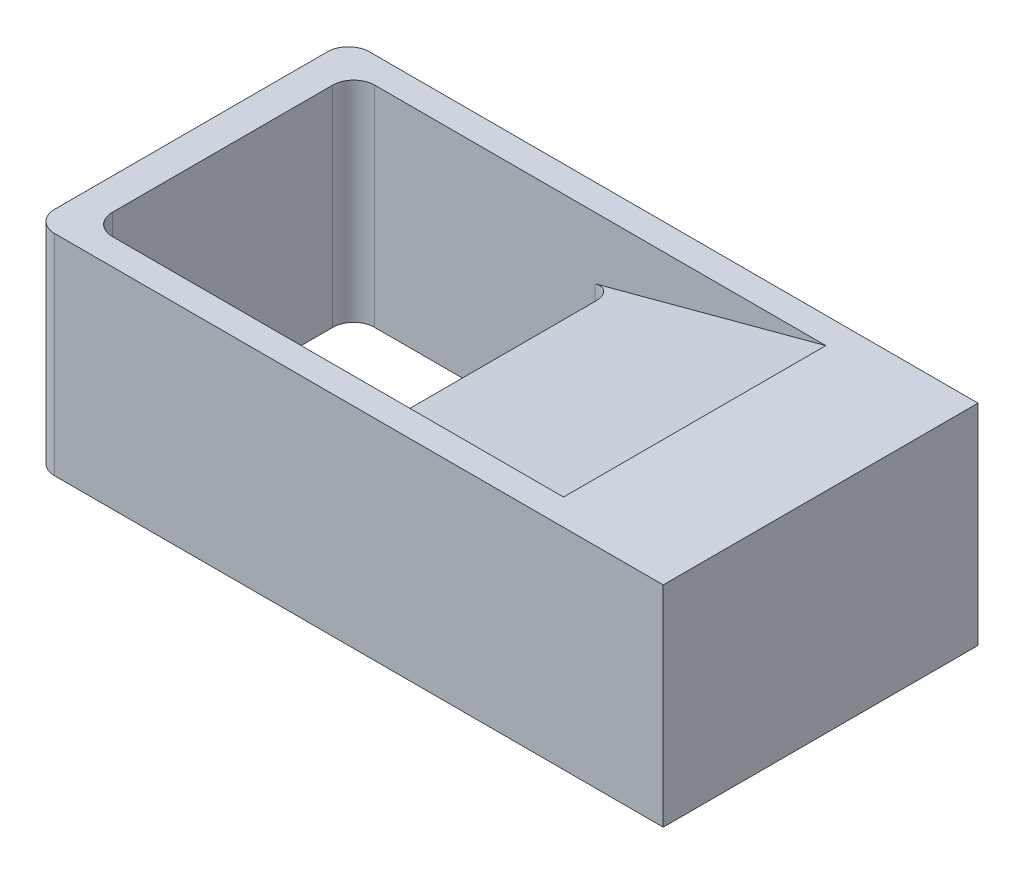
ISO-10303-21;
HEADER;
FILE_DESCRIPTION(('STEP AP214'),'2;1');
FILE_NAME('part.step','',(''),(''),'','','');
FILE_SCHEMA(('AUTOMOTIVE_DESIGN { 1 0 10303 214 1 1 1 1 }'));
ENDSEC;
DATA;
#1=APPLICATION_CONTEXT('core data for automotive mechanical design processes');
#2=APPLICATION_PROTOCOL_DEFINITION('international standard','automotive_design',2000,#1);
#3=PRODUCT_CONTEXT('',#1,'mechanical');
#4=PRODUCT('Part','Part','',(#3));
#5=PRODUCT_RELATED_PRODUCT_CATEGORY('part','',(#4));
#6=PRODUCT_DEFINITION_FORMATION('','',#4);
#7=PRODUCT_DEFINITION_CONTEXT('part definition',#1,'design');
#8=PRODUCT_DEFINITION('design','',#6,#7);
#9=PRODUCT_DEFINITION_SHAPE('','',#8);
#10=(LENGTH_UNIT() NAMED_UNIT(*) SI_UNIT(.MILLI.,.METRE.));
#11=(NAMED_UNIT(*) PLANE_ANGLE_UNIT() SI_UNIT($,.RADIAN.));
#12=(NAMED_UNIT(*) SI_UNIT($,.STERADIAN.) SOLID_ANGLE_UNIT());
#13=UNCERTAINTY_MEASURE_WITH_UNIT(LENGTH_MEASURE(1.E-05),#10,'distance_accuracy_value','');
#14=(GEOMETRIC_REPRESENTATION_CONTEXT(3) GLOBAL_UNCERTAINTY_ASSIGNED_CONTEXT((#13)) GLOBAL_UNIT_ASSIGNED_CONTEXT((#10,
#11,#12)) REPRESENTATION_CONTEXT('',''));
#15=CARTESIAN_POINT('',(0.,0.,0.));
#16=DIRECTION('',(0.,0.,1.));
#17=DIRECTION('',(1.,0.,0.));
#18=AXIS2_PLACEMENT_3D('',#15,#16,#17);
#19=CARTESIAN_POINT('',(0.,10.,0.));
#20=DIRECTION('',(0.,-1.,0.));
#21=DIRECTION('',(0.,0.,-1.));
#22=AXIS2_PLACEMENT_3D('',#19,#20,#21);
#23=PLANE('',#22);
#24=DIRECTION('',(-1.,0.,0.));
#25=VECTOR('',#24,1.);
#26=CARTESIAN_POINT('',(0.,10.,-15.));
#27=LINE('',#26,#25);
#28=CARTESIAN_POINT('',(30.,10.,-15.));
#29=VERTEX_POINT('',#28);
#30=CARTESIAN_POINT('',(1.,10.,-15.));
#31=VERTEX_POINT('',#30);
#32=EDGE_CURVE('E173',#29,#31,#27,.T.);
#33=ORIENTED_EDGE('',*,*,#32,.T.);
#34=CARTESIAN_POINT('',(1.,10.,-14.));
#35=DIRECTION('',(0.,-1.,0.));
#36=DIRECTION('',(0.,0.,-1.));
#37=AXIS2_PLACEMENT_3D('',#34,#35,#36);
#38=CIRCLE('',#37,1.);
#39=CARTESIAN_POINT('',(0.,10.,-14.));
#40=VERTEX_POINT('',#39);
#41=EDGE_CURVE('E208',#31,#40,#38,.F.);
#42=ORIENTED_EDGE('',*,*,#41,.T.);
#43=DIRECTION('',(0.,0.,1.));
#44=VECTOR('',#43,1.);
#45=CARTESIAN_POINT('',(0.,10.,0.));
#46=LINE('',#45,#44);
#47=CARTESIAN_POINT('',(0.,10.,-1.));
#48=VERTEX_POINT('',#47);
#49=EDGE_CURVE('E158',#40,#48,#46,.T.);
#50=ORIENTED_EDGE('',*,*,#49,.T.);
#51=CARTESIAN_POINT('',(1.,10.,-1.));
#52=DIRECTION('',(0.,-1.,0.));
#53=DIRECTION('',(0.,0.,-1.));
#54=AXIS2_PLACEMENT_3D('',#51,#52,#53);
#55=CIRCLE('',#54,1.);
#56=CARTESIAN_POINT('',(1.,10.,0.));
#57=VERTEX_POINT('',#56);
#58=EDGE_CURVE('E154',#48,#57,#55,.F.);
#59=ORIENTED_EDGE('',*,*,#58,.T.);
#60=DIRECTION('',(1.,0.,0.));
#61=VECTOR('',#60,1.);
#62=CARTESIAN_POINT('',(0.,10.,0.));
#63=LINE('',#62,#61);
#64=CARTESIAN_POINT('',(30.,10.,0.));
#65=VERTEX_POINT('',#64);
#66=EDGE_CURVE('E145',#57,#65,#63,.T.);
#67=ORIENTED_EDGE('',*,*,#66,.T.);
#68=DIRECTION('',(0.,0.,-1.));
#69=VECTOR('',#68,1.);
#70=CARTESIAN_POINT('',(30.,10.,0.));
#71=LINE('',#70,#69);
#72=EDGE_CURVE('E150',#65,#29,#71,.T.);
#73=ORIENTED_EDGE('',*,*,#72,.T.);
#74=EDGE_LOOP('',(#33,#42,#50,#59,#67,#73));
#75=FACE_BOUND('',#74,.T.);
#76=DIRECTION('',(-1.,0.,0.));
#77=VECTOR('',#76,1.);
#78=CARTESIAN_POINT('',(1.5,10.,-13.75));
#79=LINE('',#78,#77);
#80=CARTESIAN_POINT('',(24.0000000000001,10.,-13.75));
#81=VERTEX_POINT('',#80);
#82=CARTESIAN_POINT('',(2.5,10.,-13.75));
#83=VERTEX_POINT('',#82);
#84=EDGE_CURVE('E181',#81,#83,#79,.T.);
#85=ORIENTED_EDGE('',*,*,#84,.F.);
#86=DIRECTION('',(0.,0.,1.));
#87=VECTOR('',#86,1.);
#88=CARTESIAN_POINT('',(24.0000000000001,10.,-1.25));
#89=LINE('',#88,#87);
#90=CARTESIAN_POINT('',(24.0000000000001,10.,-1.25));
#91=VERTEX_POINT('',#90);
#92=EDGE_CURVE('E190',#81,#91,#89,.T.);
#93=ORIENTED_EDGE('',*,*,#92,.T.);
#94=DIRECTION('',(1.,0.,0.));
#95=VECTOR('',#94,1.);
#96=CARTESIAN_POINT('',(1.5,10.,-1.25));
#97=LINE('',#96,#95);
#98=CARTESIAN_POINT('',(2.5,10.,-1.25));
#99=VERTEX_POINT('',#98);
#100=EDGE_CURVE('E267',#99,#91,#97,.T.);
#101=ORIENTED_EDGE('',*,*,#100,.F.);
#102=CARTESIAN_POINT('',(2.5,10.,-2.25));
#103=DIRECTION('',(0.,-1.,0.));
#104=DIRECTION('',(0.,0.,-1.));
#105=AXIS2_PLACEMENT_3D('',#102,#103,#104);
#106=CIRCLE('',#105,1.);
#107=CARTESIAN_POINT('',(1.5,10.,-2.25));
#108=VERTEX_POINT('',#107);
#109=EDGE_CURVE('E234',#99,#108,#106,.T.);
#110=ORIENTED_EDGE('',*,*,#109,.T.);
#111=DIRECTION('',(0.,0.,1.));
#112=VECTOR('',#111,1.);
#113=CARTESIAN_POINT('',(1.5,10.,-13.75));
#114=LINE('',#113,#112);
#115=CARTESIAN_POINT('',(1.5,10.,-12.75));
#116=VERTEX_POINT('',#115);
#117=EDGE_CURVE('E264',#116,#108,#114,.T.);
#118=ORIENTED_EDGE('',*,*,#117,.F.);
#119=CARTESIAN_POINT('',(2.5,10.,-12.75));
#120=DIRECTION('',(0.,-1.,0.));
#121=DIRECTION('',(0.,0.,-1.));
#122=AXIS2_PLACEMENT_3D('',#119,#120,#121);
#123=CIRCLE('',#122,1.);
#124=EDGE_CURVE('E11',#116,#83,#123,.T.);
#125=ORIENTED_EDGE('',*,*,#124,.T.);
#126=EDGE_LOOP('',(#85,#93,#101,#110,#118,#125));
#127=FACE_BOUND('',#126,.T.);
#128=ADVANCED_FACE('F39',(#75,#127),#23,.F.);
#129=CARTESIAN_POINT('',(0.,0.,0.));
#130=DIRECTION('',(0.,-1.,0.));
#131=DIRECTION('',(0.,0.,-1.));
#132=AXIS2_PLACEMENT_3D('',#129,#130,#131);
#133=PLANE('',#132);
#134=DIRECTION('',(0.,0.,1.));
#135=VECTOR('',#134,1.);
#136=CARTESIAN_POINT('',(0.,0.,0.));
#137=LINE('',#136,#135);
#138=CARTESIAN_POINT('',(0.,0.,-14.));
#139=VERTEX_POINT('',#138);
#140=CARTESIAN_POINT('',(0.,0.,-1.));
#141=VERTEX_POINT('',#140);
#142=EDGE_CURVE('E178',#139,#141,#137,.T.);
#143=ORIENTED_EDGE('',*,*,#142,.F.);
#144=CARTESIAN_POINT('',(1.,0.,-14.));
#145=DIRECTION('',(0.,-1.,0.));
#146=DIRECTION('',(0.,0.,-1.));
#147=AXIS2_PLACEMENT_3D('',#144,#145,#146);
#148=CIRCLE('',#147,1.);
#149=CARTESIAN_POINT('',(1.,0.,-15.));
#150=VERTEX_POINT('',#149);
#151=EDGE_CURVE('E203',#139,#150,#148,.T.);
#152=ORIENTED_EDGE('',*,*,#151,.T.);
#153=DIRECTION('',(-1.,0.,0.));
#154=VECTOR('',#153,1.);
#155=CARTESIAN_POINT('',(0.,0.,-15.));
#156=LINE('',#155,#154);
#157=CARTESIAN_POINT('',(30.,0.,-15.));
#158=VERTEX_POINT('',#157);
#159=EDGE_CURVE('E185',#158,#150,#156,.T.);
#160=ORIENTED_EDGE('',*,*,#159,.F.);
#161=DIRECTION('',(0.,0.,-1.));
#162=VECTOR('',#161,1.);
#163=CARTESIAN_POINT('',(30.,0.,0.));
#164=LINE('',#163,#162);
#165=CARTESIAN_POINT('',(30.,0.,0.));
#166=VERTEX_POINT('',#165);
#167=EDGE_CURVE('E183',#166,#158,#164,.T.);
#168=ORIENTED_EDGE('',*,*,#167,.F.);
#169=DIRECTION('',(1.,0.,0.));
#170=VECTOR('',#169,1.);
#171=CARTESIAN_POINT('',(0.,0.,0.));
#172=LINE('',#171,#170);
#173=CARTESIAN_POINT('',(1.,0.,0.));
#174=VERTEX_POINT('',#173);
#175=EDGE_CURVE('E164',#174,#166,#172,.T.);
#176=ORIENTED_EDGE('',*,*,#175,.F.);
#177=CARTESIAN_POINT('',(1.,0.,-1.));
#178=DIRECTION('',(0.,-1.,0.));
#179=DIRECTION('',(0.,0.,-1.));
#180=AXIS2_PLACEMENT_3D('',#177,#178,#179);
#181=CIRCLE('',#180,1.);
#182=EDGE_CURVE('E201',#174,#141,#181,.T.);
#183=ORIENTED_EDGE('',*,*,#182,.T.);
#184=EDGE_LOOP('',(#143,#152,#160,#168,#176,#183));
#185=FACE_BOUND('',#184,.T.);
#186=DIRECTION('',(0.,0.,-1.));
#187=VECTOR('',#186,1.);
#188=CARTESIAN_POINT('',(14.,0.,-13.75));
#189=LINE('',#188,#187);
#190=CARTESIAN_POINT('',(14.,0.,-2.25));
#191=VERTEX_POINT('',#190);
#192=CARTESIAN_POINT('',(14.,0.,-12.75));
#193=VERTEX_POINT('',#192);
#194=EDGE_CURVE('E274',#191,#193,#189,.T.);
#195=ORIENTED_EDGE('',*,*,#194,.T.);
#196=CARTESIAN_POINT('',(13.,0.,-12.75));
#197=DIRECTION('',(0.,-1.,0.));
#198=DIRECTION('',(0.,0.,-1.));
#199=AXIS2_PLACEMENT_3D('',#196,#197,#198);
#200=CIRCLE('',#199,1.);
#201=CARTESIAN_POINT('',(13.,0.,-13.75));
#202=VERTEX_POINT('',#201);
#203=EDGE_CURVE('E241',#193,#202,#200,.F.);
#204=ORIENTED_EDGE('',*,*,#203,.T.);
#205=DIRECTION('',(-1.,0.,0.));
#206=VECTOR('',#205,1.);
#207=CARTESIAN_POINT('',(1.5,0.,-13.75));
#208=LINE('',#207,#206);
#209=CARTESIAN_POINT('',(2.5,0.,-13.75));
#210=VERTEX_POINT('',#209);
#211=EDGE_CURVE('E251',#202,#210,#208,.T.);
#212=ORIENTED_EDGE('',*,*,#211,.T.);
#213=CARTESIAN_POINT('',(2.5,0.,-12.75));
#214=DIRECTION('',(0.,-1.,0.));
#215=DIRECTION('',(0.,0.,-1.));
#216=AXIS2_PLACEMENT_3D('',#213,#214,#215);
#217=CIRCLE('',#216,1.);
#218=CARTESIAN_POINT('',(1.5,0.,-12.75));
#219=VERTEX_POINT('',#218);
#220=EDGE_CURVE('E47',#210,#219,#217,.F.);
#221=ORIENTED_EDGE('',*,*,#220,.T.);
#222=DIRECTION('',(0.,0.,1.));
#223=VECTOR('',#222,1.);
#224=CARTESIAN_POINT('',(1.5,0.,-13.75));
#225=LINE('',#224,#223);
#226=CARTESIAN_POINT('',(1.5,0.,-2.25));
#227=VERTEX_POINT('',#226);
#228=EDGE_CURVE('E249',#219,#227,#225,.T.);
#229=ORIENTED_EDGE('',*,*,#228,.T.);
#230=CARTESIAN_POINT('',(2.5,0.,-2.25));
#231=DIRECTION('',(0.,-1.,0.));
#232=DIRECTION('',(0.,0.,-1.));
#233=AXIS2_PLACEMENT_3D('',#230,#231,#232);
#234=CIRCLE('',#233,1.);
#235=CARTESIAN_POINT('',(2.5,0.,-1.25));
#236=VERTEX_POINT('',#235);
#237=EDGE_CURVE('E232',#227,#236,#234,.F.);
#238=ORIENTED_EDGE('',*,*,#237,.T.);
#239=DIRECTION('',(1.,0.,0.));
#240=VECTOR('',#239,1.);
#241=CARTESIAN_POINT('',(1.5,0.,-1.25));
#242=LINE('',#241,#240);
#243=CARTESIAN_POINT('',(13.,0.,-1.25));
#244=VERTEX_POINT('',#243);
#245=EDGE_CURVE('E260',#236,#244,#242,.T.);
#246=ORIENTED_EDGE('',*,*,#245,.T.);
#247=CARTESIAN_POINT('',(13.,0.,-2.25));
#248=DIRECTION('',(0.,-1.,0.));
#249=DIRECTION('',(0.,0.,-1.));
#250=AXIS2_PLACEMENT_3D('',#247,#248,#249);
#251=CIRCLE('',#250,1.);
#252=EDGE_CURVE('E236',#244,#191,#251,.F.);
#253=ORIENTED_EDGE('',*,*,#252,.T.);
#254=EDGE_LOOP('',(#195,#204,#212,#221,#229,#238,#246,#253));
#255=FACE_BOUND('',#254,.T.);
#256=ADVANCED_FACE('F248',(#185,#255),#133,.T.);
#257=CARTESIAN_POINT('',(0.,10.,0.));
#258=DIRECTION('',(1.,0.,0.));
#259=DIRECTION('',(0.,0.,-1.));
#260=AXIS2_PLACEMENT_3D('',#257,#258,#259);
#261=PLANE('',#260);
#262=ORIENTED_EDGE('',*,*,#49,.F.);
#263=DIRECTION('',(0.,-1.,0.));
#264=VECTOR('',#263,1.);
#265=CARTESIAN_POINT('',(0.,10.,-14.));
#266=LINE('',#265,#264);
#267=EDGE_CURVE('E198',#40,#139,#266,.T.);
#268=ORIENTED_EDGE('',*,*,#267,.T.);
#269=ORIENTED_EDGE('',*,*,#142,.T.);
#270=DIRECTION('',(0.,-1.,0.));
#271=VECTOR('',#270,1.);
#272=CARTESIAN_POINT('',(0.,10.,-1.));
#273=LINE('',#272,#271);
#274=EDGE_CURVE('E196',#141,#48,#273,.F.);
#275=ORIENTED_EDGE('',*,*,#274,.T.);
#276=EDGE_LOOP('',(#262,#268,#269,#275));
#277=FACE_BOUND('',#276,.T.);
#278=ADVANCED_FACE('F291',(#277),#261,.F.);
#279=CARTESIAN_POINT('',(0.,10.,0.));
#280=DIRECTION('',(0.,0.,-1.));
#281=DIRECTION('',(-1.,0.,0.));
#282=AXIS2_PLACEMENT_3D('',#279,#280,#281);
#283=PLANE('',#282);
#284=ORIENTED_EDGE('',*,*,#66,.F.);
#285=DIRECTION('',(0.,-1.,0.));
#286=VECTOR('',#285,1.);
#287=CARTESIAN_POINT('',(1.,10.,0.));
#288=LINE('',#287,#286);
#289=EDGE_CURVE('E210',#57,#174,#288,.T.);
#290=ORIENTED_EDGE('',*,*,#289,.T.);
#291=ORIENTED_EDGE('',*,*,#175,.T.);
#292=DIRECTION('',(0.,-1.,0.));
#293=VECTOR('',#292,1.);
#294=CARTESIAN_POINT('',(30.,10.,0.));
#295=LINE('',#294,#293);
#296=EDGE_CURVE('E161',#65,#166,#295,.T.);
#297=ORIENTED_EDGE('',*,*,#296,.F.);
#298=EDGE_LOOP('',(#284,#290,#291,#297));
#299=FACE_BOUND('',#298,.T.);
#300=ADVANCED_FACE('F162',(#299),#283,.F.);
#301=CARTESIAN_POINT('',(30.,10.,0.));
#302=DIRECTION('',(-1.,0.,0.));
#303=DIRECTION('',(0.,0.,1.));
#304=AXIS2_PLACEMENT_3D('',#301,#302,#303);
#305=PLANE('',#304);
#306=ORIENTED_EDGE('',*,*,#167,.T.);
#307=DIRECTION('',(0.,-1.,0.));
#308=VECTOR('',#307,1.);
#309=CARTESIAN_POINT('',(30.,10.,-15.));
#310=LINE('',#309,#308);
#311=EDGE_CURVE('E168',#29,#158,#310,.T.);
#312=ORIENTED_EDGE('',*,*,#311,.F.);
#313=ORIENTED_EDGE('',*,*,#72,.F.);
#314=ORIENTED_EDGE('',*,*,#296,.T.);
#315=EDGE_LOOP('',(#306,#312,#313,#314));
#316=FACE_BOUND('',#315,.T.);
#317=ADVANCED_FACE('F170',(#316),#305,.F.);
#318=CARTESIAN_POINT('',(0.,10.,-15.));
#319=DIRECTION('',(0.,0.,1.));
#320=DIRECTION('',(1.,0.,0.));
#321=AXIS2_PLACEMENT_3D('',#318,#319,#320);
#322=PLANE('',#321);
#323=ORIENTED_EDGE('',*,*,#159,.T.);
#324=DIRECTION('',(0.,-1.,0.));
#325=VECTOR('',#324,1.);
#326=CARTESIAN_POINT('',(1.,10.,-15.));
#327=LINE('',#326,#325);
#328=EDGE_CURVE('E205',#150,#31,#327,.F.);
#329=ORIENTED_EDGE('',*,*,#328,.T.);
#330=ORIENTED_EDGE('',*,*,#32,.F.);
#331=ORIENTED_EDGE('',*,*,#311,.T.);
#332=EDGE_LOOP('',(#323,#329,#330,#331));
#333=FACE_BOUND('',#332,.T.);
#334=ADVANCED_FACE('F287',(#333),#322,.F.);
#335=CARTESIAN_POINT('',(1.5,10.,-13.75));
#336=DIRECTION('',(1.,0.,0.));
#337=DIRECTION('',(0.,0.,-1.));
#338=AXIS2_PLACEMENT_3D('',#335,#336,#337);
#339=PLANE('',#338);
#340=ORIENTED_EDGE('',*,*,#117,.T.);
#341=DIRECTION('',(0.,-1.,0.));
#342=VECTOR('',#341,1.);
#343=CARTESIAN_POINT('',(1.5,0.,-2.25));
#344=LINE('',#343,#342);
#345=EDGE_CURVE('E214',#108,#227,#344,.T.);
#346=ORIENTED_EDGE('',*,*,#345,.T.);
#347=ORIENTED_EDGE('',*,*,#228,.F.);
#348=DIRECTION('',(0.,-1.,0.));
#349=VECTOR('',#348,1.);
#350=CARTESIAN_POINT('',(1.5,10.,-12.75));
#351=LINE('',#350,#349);
#352=EDGE_CURVE('E212',#219,#116,#351,.F.);
#353=ORIENTED_EDGE('',*,*,#352,.T.);
#354=EDGE_LOOP('',(#340,#346,#347,#353));
#355=FACE_BOUND('',#354,.T.);
#356=ADVANCED_FACE('F257',(#355),#339,.T.);
#357=CARTESIAN_POINT('',(1.5,10.,-1.25));
#358=DIRECTION('',(0.,0.,-1.));
#359=DIRECTION('',(-1.,0.,0.));
#360=AXIS2_PLACEMENT_3D('',#357,#358,#359);
#361=PLANE('',#360);
#362=ORIENTED_EDGE('',*,*,#245,.F.);
#363=DIRECTION('',(0.,-1.,0.));
#364=VECTOR('',#363,1.);
#365=CARTESIAN_POINT('',(2.5,10.,-1.25));
#366=LINE('',#365,#364);
#367=EDGE_CURVE('E220',#236,#99,#366,.F.);
#368=ORIENTED_EDGE('',*,*,#367,.T.);
#369=ORIENTED_EDGE('',*,*,#100,.T.);
#370=DIRECTION('',(-0.965925826289069,-0.258819045102518,0.));
#371=VECTOR('',#370,1.);
#372=CARTESIAN_POINT('',(14.,7.32050807568877,-1.25));
#373=LINE('',#372,#371);
#374=CARTESIAN_POINT('',(13.,7.05255888325765,-1.25));
#375=VERTEX_POINT('',#374);
#376=EDGE_CURVE('E194',#91,#375,#373,.T.);
#377=ORIENTED_EDGE('',*,*,#376,.T.);
#378=DIRECTION('',(0.,-1.,0.));
#379=VECTOR('',#378,1.);
#380=CARTESIAN_POINT('',(13.,0.,-1.25));
#381=LINE('',#380,#379);
#382=EDGE_CURVE('E217',#375,#244,#381,.T.);
#383=ORIENTED_EDGE('',*,*,#382,.T.);
#384=EDGE_LOOP('',(#362,#368,#369,#377,#383));
#385=FACE_BOUND('',#384,.T.);
#386=ADVANCED_FACE('F325',(#385),#361,.T.);
#387=CARTESIAN_POINT('',(14.,10.,-13.75));
#388=DIRECTION('',(-1.,0.,0.));
#389=DIRECTION('',(0.,0.,1.));
#390=AXIS2_PLACEMENT_3D('',#387,#388,#389);
#391=PLANE('',#390);
#392=ORIENTED_EDGE('',*,*,#194,.F.);
#393=DIRECTION('',(0.,-1.,0.));
#394=VECTOR('',#393,1.);
#395=CARTESIAN_POINT('',(14.,7.32050807568877,-2.25));
#396=LINE('',#395,#394);
#397=CARTESIAN_POINT('',(14.,7.32050807568877,-2.25));
#398=VERTEX_POINT('',#397);
#399=EDGE_CURVE('E225',#191,#398,#396,.F.);
#400=ORIENTED_EDGE('',*,*,#399,.T.);
#401=DIRECTION('',(0.,0.,-1.));
#402=VECTOR('',#401,1.);
#403=CARTESIAN_POINT('',(14.,7.32050807568877,-13.75));
#404=LINE('',#403,#402);
#405=CARTESIAN_POINT('',(14.,7.32050807568877,-12.75));
#406=VERTEX_POINT('',#405);
#407=EDGE_CURVE('E167',#398,#406,#404,.T.);
#408=ORIENTED_EDGE('',*,*,#407,.T.);
#409=DIRECTION('',(0.,-1.,0.));
#410=VECTOR('',#409,1.);
#411=CARTESIAN_POINT('',(14.,0.,-12.75));
#412=LINE('',#411,#410);
#413=EDGE_CURVE('E222',#406,#193,#412,.T.);
#414=ORIENTED_EDGE('',*,*,#413,.T.);
#415=EDGE_LOOP('',(#392,#400,#408,#414));
#416=FACE_BOUND('',#415,.T.);
#417=ADVANCED_FACE('F331',(#416),#391,.T.);
#418=CARTESIAN_POINT('',(1.5,10.,-13.75));
#419=DIRECTION('',(0.,0.,1.));
#420=DIRECTION('',(1.,0.,0.));
#421=AXIS2_PLACEMENT_3D('',#418,#419,#420);
#422=PLANE('',#421);
#423=ORIENTED_EDGE('',*,*,#211,.F.);
#424=DIRECTION('',(0.,-1.,0.));
#425=VECTOR('',#424,1.);
#426=CARTESIAN_POINT('',(13.,7.32050807568877,-13.75));
#427=LINE('',#426,#425);
#428=CARTESIAN_POINT('',(13.,7.05255888325765,-13.75));
#429=VERTEX_POINT('',#428);
#430=EDGE_CURVE('E230',#202,#429,#427,.F.);
#431=ORIENTED_EDGE('',*,*,#430,.T.);
#432=DIRECTION('',(0.965925826289069,0.258819045102518,0.));
#433=VECTOR('',#432,1.);
#434=CARTESIAN_POINT('',(14.,7.32050807568877,-13.75));
#435=LINE('',#434,#433);
#436=EDGE_CURVE('E54',#429,#81,#435,.T.);
#437=ORIENTED_EDGE('',*,*,#436,.T.);
#438=ORIENTED_EDGE('',*,*,#84,.T.);
#439=DIRECTION('',(0.,-1.,0.));
#440=VECTOR('',#439,1.);
#441=CARTESIAN_POINT('',(2.5,0.,-13.75));
#442=LINE('',#441,#440);
#443=EDGE_CURVE('E227',#83,#210,#442,.T.);
#444=ORIENTED_EDGE('',*,*,#443,.T.);
#445=EDGE_LOOP('',(#423,#431,#437,#438,#444));
#446=FACE_BOUND('',#445,.T.);
#447=ADVANCED_FACE('F266',(#446),#422,.T.);
#448=CARTESIAN_POINT('',(14.,7.32050807568877,-13.75));
#449=DIRECTION('',(-0.258819045102518,0.965925826289069,0.));
#450=DIRECTION('',(0.,0.,1.));
#451=AXIS2_PLACEMENT_3D('',#448,#449,#450);
#452=PLANE('',#451);
#453=ORIENTED_EDGE('',*,*,#376,.F.);
#454=ORIENTED_EDGE('',*,*,#92,.F.);
#455=ORIENTED_EDGE('',*,*,#436,.F.);
#456=CARTESIAN_POINT('',(13.,7.05255888325765,-12.75));
#457=DIRECTION('',(-0.258819045102518,0.965925826289069,0.));
#458=DIRECTION('',(0.965925826289069,0.258819045102518,0.));
#459=AXIS2_PLACEMENT_3D('',#456,#457,#458);
#460=ELLIPSE('',#459,1.03527618041008,1.);
#461=EDGE_CURVE('E59',#429,#406,#460,.F.);
#462=ORIENTED_EDGE('',*,*,#461,.T.);
#463=ORIENTED_EDGE('',*,*,#407,.F.);
#464=CARTESIAN_POINT('',(13.,7.05255888325765,-2.25));
#465=DIRECTION('',(-0.258819045102518,0.965925826289069,0.));
#466=DIRECTION('',(0.965925826289069,0.258819045102518,0.));
#467=AXIS2_PLACEMENT_3D('',#464,#465,#466);
#468=ELLIPSE('',#467,1.03527618041008,1.);
#469=EDGE_CURVE('E238',#398,#375,#468,.F.);
#470=ORIENTED_EDGE('',*,*,#469,.T.);
#471=EDGE_LOOP('',(#453,#454,#455,#462,#463,#470));
#472=FACE_BOUND('',#471,.T.);
#473=ADVANCED_FACE('F345',(#472),#452,.T.);
#474=CARTESIAN_POINT('',(1.,10.,-14.));
#475=DIRECTION('',(0.,-1.,0.));
#476=DIRECTION('',(0.,0.,-1.));
#477=AXIS2_PLACEMENT_3D('',#474,#475,#476);
#478=CYLINDRICAL_SURFACE('',#477,1.);
#479=ORIENTED_EDGE('',*,*,#41,.F.);
#480=ORIENTED_EDGE('',*,*,#328,.F.);
#481=ORIENTED_EDGE('',*,*,#151,.F.);
#482=ORIENTED_EDGE('',*,*,#267,.F.);
#483=EDGE_LOOP('',(#479,#480,#481,#482));
#484=FACE_BOUND('',#483,.T.);
#485=ADVANCED_FACE('F290',(#484),#478,.T.);
#486=CARTESIAN_POINT('',(1.,10.,-1.));
#487=DIRECTION('',(0.,-1.,0.));
#488=DIRECTION('',(0.,0.,-1.));
#489=AXIS2_PLACEMENT_3D('',#486,#487,#488);
#490=CYLINDRICAL_SURFACE('',#489,1.);
#491=ORIENTED_EDGE('',*,*,#58,.F.);
#492=ORIENTED_EDGE('',*,*,#274,.F.);
#493=ORIENTED_EDGE('',*,*,#182,.F.);
#494=ORIENTED_EDGE('',*,*,#289,.F.);
#495=EDGE_LOOP('',(#491,#492,#493,#494));
#496=FACE_BOUND('',#495,.T.);
#497=ADVANCED_FACE('F282',(#496),#490,.T.);
#498=CARTESIAN_POINT('',(2.5,10.,-2.25));
#499=DIRECTION('',(0.,1.,0.));
#500=DIRECTION('',(0.,0.,1.));
#501=AXIS2_PLACEMENT_3D('',#498,#499,#500);
#502=CYLINDRICAL_SURFACE('',#501,1.);
#503=ORIENTED_EDGE('',*,*,#109,.F.);
#504=ORIENTED_EDGE('',*,*,#367,.F.);
#505=ORIENTED_EDGE('',*,*,#237,.F.);
#506=ORIENTED_EDGE('',*,*,#345,.F.);
#507=EDGE_LOOP('',(#503,#504,#505,#506));
#508=FACE_BOUND('',#507,.T.);
#509=ADVANCED_FACE('F363',(#508),#502,.F.);
#510=CARTESIAN_POINT('',(13.,10.,-2.25));
#511=DIRECTION('',(0.,1.,0.));
#512=DIRECTION('',(0.,0.,1.));
#513=AXIS2_PLACEMENT_3D('',#510,#511,#512);
#514=CYLINDRICAL_SURFACE('',#513,1.);
#515=ORIENTED_EDGE('',*,*,#469,.F.);
#516=ORIENTED_EDGE('',*,*,#399,.F.);
#517=ORIENTED_EDGE('',*,*,#252,.F.);
#518=ORIENTED_EDGE('',*,*,#382,.F.);
#519=EDGE_LOOP('',(#515,#516,#517,#518));
#520=FACE_BOUND('',#519,.T.);
#521=ADVANCED_FACE('F370',(#520),#514,.F.);
#522=CARTESIAN_POINT('',(13.,10.,-12.75));
#523=DIRECTION('',(0.,1.,0.));
#524=DIRECTION('',(0.,0.,1.));
#525=AXIS2_PLACEMENT_3D('',#522,#523,#524);
#526=CYLINDRICAL_SURFACE('',#525,1.);
#527=ORIENTED_EDGE('',*,*,#461,.F.);
#528=ORIENTED_EDGE('',*,*,#430,.F.);
#529=ORIENTED_EDGE('',*,*,#203,.F.);
#530=ORIENTED_EDGE('',*,*,#413,.F.);
#531=EDGE_LOOP('',(#527,#528,#529,#530));
#532=FACE_BOUND('',#531,.T.);
#533=ADVANCED_FACE('F378',(#532),#526,.F.);
#534=CARTESIAN_POINT('',(2.5,10.,-12.75));
#535=DIRECTION('',(0.,1.,0.));
#536=DIRECTION('',(0.,0.,1.));
#537=AXIS2_PLACEMENT_3D('',#534,#535,#536);
#538=CYLINDRICAL_SURFACE('',#537,1.);
#539=ORIENTED_EDGE('',*,*,#124,.F.);
#540=ORIENTED_EDGE('',*,*,#352,.F.);
#541=ORIENTED_EDGE('',*,*,#220,.F.);
#542=ORIENTED_EDGE('',*,*,#443,.F.);
#543=EDGE_LOOP('',(#539,#540,#541,#542));
#544=FACE_BOUND('',#543,.T.);
#545=ADVANCED_FACE('F41',(#544),#538,.F.);
#546=CLOSED_SHELL('',(#128,#256,#278,#300,#317,#334,#356,#386,#417,#447,#473,#485,#497,#509,
#521,#533,#545));
#547=MANIFOLD_SOLID_BREP('B2',#546);
#548=ADVANCED_BREP_SHAPE_REPRESENTATION('',(#18,#547),#14);
#549=SHAPE_DEFINITION_REPRESENTATION(#9,#548);
ENDSEC;
END-ISO-10303-21;
